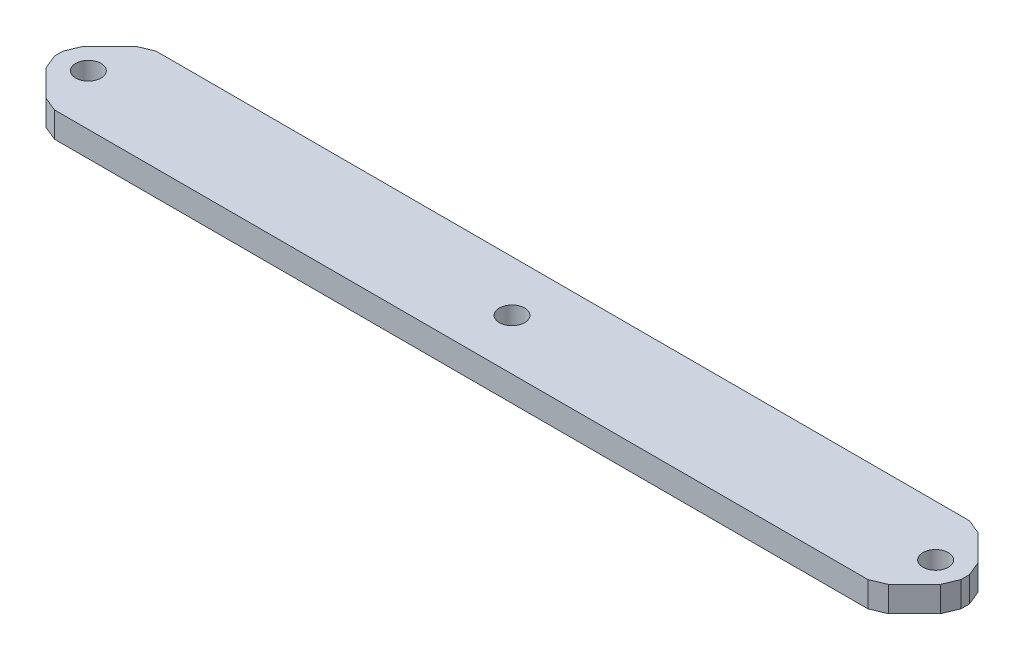
ISO-10303-21;
HEADER;
FILE_DESCRIPTION(('STEP AP214'),'2;1');
FILE_NAME('part.step','',(''),(''),'','','');
FILE_SCHEMA(('AUTOMOTIVE_DESIGN { 1 0 10303 214 1 1 1 1 }'));
ENDSEC;
DATA;
#1=APPLICATION_CONTEXT('core data for automotive mechanical design processes');
#2=APPLICATION_PROTOCOL_DEFINITION('international standard','automotive_design',2000,#1);
#3=PRODUCT_CONTEXT('',#1,'mechanical');
#4=PRODUCT('Part','Part','',(#3));
#5=PRODUCT_RELATED_PRODUCT_CATEGORY('part','',(#4));
#6=PRODUCT_DEFINITION_FORMATION('','',#4);
#7=PRODUCT_DEFINITION_CONTEXT('part definition',#1,'design');
#8=PRODUCT_DEFINITION('design','',#6,#7);
#9=PRODUCT_DEFINITION_SHAPE('','',#8);
#10=(LENGTH_UNIT() NAMED_UNIT(*) SI_UNIT(.MILLI.,.METRE.));
#11=(NAMED_UNIT(*) PLANE_ANGLE_UNIT() SI_UNIT($,.RADIAN.));
#12=(NAMED_UNIT(*) SI_UNIT($,.STERADIAN.) SOLID_ANGLE_UNIT());
#13=UNCERTAINTY_MEASURE_WITH_UNIT(LENGTH_MEASURE(1.E-05),#10,'distance_accuracy_value','');
#14=(GEOMETRIC_REPRESENTATION_CONTEXT(3) GLOBAL_UNCERTAINTY_ASSIGNED_CONTEXT((#13)) GLOBAL_UNIT_ASSIGNED_CONTEXT((#10,
#11,#12)) REPRESENTATION_CONTEXT('',''));
#15=CARTESIAN_POINT('',(0.,0.,0.));
#16=DIRECTION('',(0.,0.,1.));
#17=DIRECTION('',(1.,0.,0.));
#18=AXIS2_PLACEMENT_3D('',#15,#16,#17);
#19=CARTESIAN_POINT('',(0.,3.,0.));
#20=DIRECTION('',(0.,-1.,0.));
#21=DIRECTION('',(0.,0.,-1.));
#22=AXIS2_PLACEMENT_3D('',#19,#20,#21);
#23=PLANE('',#22);
#24=CARTESIAN_POINT('',(-50.,3.,0.));
#25=DIRECTION('',(0.,1.,0.));
#26=DIRECTION('',(0.,0.,1.));
#27=AXIS2_PLACEMENT_3D('',#24,#25,#26);
#28=CIRCLE('',#27,1.5);
#29=CARTESIAN_POINT('',(-50.,3.,1.5));
#30=VERTEX_POINT('',#29);
#31=EDGE_CURVE('E347',#30,#30,#28,.T.);
#32=ORIENTED_EDGE('',*,*,#31,.F.);
#33=EDGE_LOOP('',(#32));
#34=FACE_BOUND('',#33,.T.);
#35=CARTESIAN_POINT('',(0.,3.,0.));
#36=DIRECTION('',(0.,1.,0.));
#37=DIRECTION('',(0.,0.,1.));
#38=AXIS2_PLACEMENT_3D('',#35,#36,#37);
#39=CIRCLE('',#38,1.5);
#40=CARTESIAN_POINT('',(0.,3.,1.5));
#41=VERTEX_POINT('',#40);
#42=EDGE_CURVE('E341',#41,#41,#39,.T.);
#43=ORIENTED_EDGE('',*,*,#42,.F.);
#44=EDGE_LOOP('',(#43));
#45=FACE_BOUND('',#44,.T.);
#46=CARTESIAN_POINT('',(50.,3.,0.));
#47=DIRECTION('',(0.,1.,0.));
#48=DIRECTION('',(0.,0.,1.));
#49=AXIS2_PLACEMENT_3D('',#46,#47,#48);
#50=CIRCLE('',#49,1.5);
#51=CARTESIAN_POINT('',(50.,3.,1.5));
#52=VERTEX_POINT('',#51);
#53=EDGE_CURVE('E332',#52,#52,#50,.T.);
#54=ORIENTED_EDGE('',*,*,#53,.F.);
#55=EDGE_LOOP('',(#54));
#56=FACE_BOUND('',#55,.T.);
#57=DIRECTION('',(1.,0.,0.));
#58=VECTOR('',#57,1.);
#59=CARTESIAN_POINT('',(-52.,3.,6.));
#60=LINE('',#59,#58);
#61=CARTESIAN_POINT('',(-48.,3.,6.));
#62=VERTEX_POINT('',#61);
#63=CARTESIAN_POINT('',(48.,3.,6.));
#64=VERTEX_POINT('',#63);
#65=EDGE_CURVE('E246',#62,#64,#60,.T.);
#66=ORIENTED_EDGE('',*,*,#65,.T.);
#67=DIRECTION('',(-0.923879532511288,0.,0.382683432365087));
#68=VECTOR('',#67,1.);
#69=CARTESIAN_POINT('',(48.,3.,6.));
#70=LINE('',#69,#68);
#71=CARTESIAN_POINT('',(49.7071067811866,3.,5.29289321881345));
#72=VERTEX_POINT('',#71);
#73=EDGE_CURVE('E370',#64,#72,#70,.F.);
#74=ORIENTED_EDGE('',*,*,#73,.T.);
#75=DIRECTION('',(0.707106781186548,0.,-0.707106781186547));
#76=VECTOR('',#75,1.);
#77=CARTESIAN_POINT('',(27.4999999999999,3.,27.5));
#78=LINE('',#77,#76);
#79=CARTESIAN_POINT('',(52.7928932188135,3.,2.20710678118655));
#80=VERTEX_POINT('',#79);
#81=EDGE_CURVE('E382',#72,#80,#78,.T.);
#82=ORIENTED_EDGE('',*,*,#81,.T.);
#83=DIRECTION('',(-0.382683432365088,0.,0.923879532511288));
#84=VECTOR('',#83,1.);
#85=CARTESIAN_POINT('',(52.7928932188135,3.,2.20710678118654));
#86=LINE('',#85,#84);
#87=CARTESIAN_POINT('',(53.5,3.,0.500000000000011));
#88=VERTEX_POINT('',#87);
#89=EDGE_CURVE('E368',#80,#88,#86,.F.);
#90=ORIENTED_EDGE('',*,*,#89,.T.);
#91=DIRECTION('',(0.,0.,-1.));
#92=VECTOR('',#91,1.);
#93=CARTESIAN_POINT('',(53.5,3.,0.));
#94=LINE('',#93,#92);
#95=CARTESIAN_POINT('',(53.5,3.,-0.499999999999979));
#96=VERTEX_POINT('',#95);
#97=EDGE_CURVE('E329',#88,#96,#94,.T.);
#98=ORIENTED_EDGE('',*,*,#97,.T.);
#99=DIRECTION('',(-0.382683432365088,0.,-0.923879532511288));
#100=VECTOR('',#99,1.);
#101=CARTESIAN_POINT('',(53.5,3.,-0.499999999999979));
#102=LINE('',#101,#100);
#103=CARTESIAN_POINT('',(52.7928932188134,3.,-2.20710678118657));
#104=VERTEX_POINT('',#103);
#105=EDGE_CURVE('E366',#96,#104,#102,.T.);
#106=ORIENTED_EDGE('',*,*,#105,.T.);
#107=DIRECTION('',(0.707106781186548,0.,0.707106781186547));
#108=VECTOR('',#107,1.);
#109=CARTESIAN_POINT('',(27.4999999999999,3.,-27.5));
#110=LINE('',#109,#108);
#111=CARTESIAN_POINT('',(49.7071067811865,3.,-5.29289321881346));
#112=VERTEX_POINT('',#111);
#113=EDGE_CURVE('E390',#112,#104,#110,.T.);
#114=ORIENTED_EDGE('',*,*,#113,.F.);
#115=DIRECTION('',(0.923879532511289,0.,0.382683432365084));
#116=VECTOR('',#115,1.);
#117=CARTESIAN_POINT('',(49.7071067811865,3.,-5.29289321881346));
#118=LINE('',#117,#116);
#119=CARTESIAN_POINT('',(48.,3.,-6.));
#120=VERTEX_POINT('',#119);
#121=EDGE_CURVE('E364',#112,#120,#118,.F.);
#122=ORIENTED_EDGE('',*,*,#121,.T.);
#123=DIRECTION('',(1.,0.,0.));
#124=VECTOR('',#123,1.);
#125=CARTESIAN_POINT('',(-52.,3.,-6.));
#126=LINE('',#125,#124);
#127=CARTESIAN_POINT('',(-48.,3.,-6.));
#128=VERTEX_POINT('',#127);
#129=EDGE_CURVE('E259',#128,#120,#126,.T.);
#130=ORIENTED_EDGE('',*,*,#129,.F.);
#131=DIRECTION('',(-0.923879532511288,0.,0.382683432365086));
#132=VECTOR('',#131,1.);
#133=CARTESIAN_POINT('',(-48.,3.,-6.));
#134=LINE('',#133,#132);
#135=CARTESIAN_POINT('',(-49.7071067811866,3.,-5.29289321881345));
#136=VERTEX_POINT('',#135);
#137=EDGE_CURVE('E362',#128,#136,#134,.T.);
#138=ORIENTED_EDGE('',*,*,#137,.T.);
#139=DIRECTION('',(-0.707106781186549,0.,0.707106781186547));
#140=VECTOR('',#139,1.);
#141=CARTESIAN_POINT('',(-27.4999999999999,3.,-27.5));
#142=LINE('',#141,#140);
#143=CARTESIAN_POINT('',(-52.7928932188135,3.,-2.20710678118657));
#144=VERTEX_POINT('',#143);
#145=EDGE_CURVE('E388',#136,#144,#142,.T.);
#146=ORIENTED_EDGE('',*,*,#145,.T.);
#147=DIRECTION('',(0.38268343236509,0.,-0.923879532511287));
#148=VECTOR('',#147,1.);
#149=CARTESIAN_POINT('',(-52.7928932188135,3.,-2.20710678118657));
#150=LINE('',#149,#148);
#151=CARTESIAN_POINT('',(-53.5,3.,-0.500000000000015));
#152=VERTEX_POINT('',#151);
#153=EDGE_CURVE('E327',#144,#152,#150,.F.);
#154=ORIENTED_EDGE('',*,*,#153,.T.);
#155=DIRECTION('',(0.,0.,1.));
#156=VECTOR('',#155,1.);
#157=CARTESIAN_POINT('',(-53.5,3.,0.));
#158=LINE('',#157,#156);
#159=CARTESIAN_POINT('',(-53.5,3.,0.499999999999961));
#160=VERTEX_POINT('',#159);
#161=EDGE_CURVE('E322',#152,#160,#158,.T.);
#162=ORIENTED_EDGE('',*,*,#161,.T.);
#163=DIRECTION('',(0.382683432365089,0.,0.923879532511287));
#164=VECTOR('',#163,1.);
#165=CARTESIAN_POINT('',(-53.5,3.,0.499999999999961));
#166=LINE('',#165,#164);
#167=CARTESIAN_POINT('',(-52.7928932188134,3.,2.2071067811866));
#168=VERTEX_POINT('',#167);
#169=EDGE_CURVE('E317',#160,#168,#166,.T.);
#170=ORIENTED_EDGE('',*,*,#169,.T.);
#171=DIRECTION('',(-0.707106781186549,0.,-0.707106781186547));
#172=VECTOR('',#171,1.);
#173=CARTESIAN_POINT('',(-27.4999999999999,3.,27.5));
#174=LINE('',#173,#172);
#175=CARTESIAN_POINT('',(-49.7071067811866,3.,5.29289321881344));
#176=VERTEX_POINT('',#175);
#177=EDGE_CURVE('E309',#176,#168,#174,.T.);
#178=ORIENTED_EDGE('',*,*,#177,.F.);
#179=DIRECTION('',(0.923879532511287,0.,0.38268343236509));
#180=VECTOR('',#179,1.);
#181=CARTESIAN_POINT('',(-49.7071067811866,3.,5.29289321881344));
#182=LINE('',#181,#180);
#183=EDGE_CURVE('E359',#176,#62,#182,.T.);
#184=ORIENTED_EDGE('',*,*,#183,.T.);
#185=EDGE_LOOP('',(#66,#74,#82,#90,#98,#106,#114,#122,#130,#138,#146,#154,#162,#170,#178,#184));
#186=FACE_BOUND('',#185,.T.);
#187=ADVANCED_FACE('F122',(#34,#45,#56,#186),#23,.F.);
#188=CARTESIAN_POINT('',(0.,0.,0.));
#189=DIRECTION('',(0.,-1.,0.));
#190=DIRECTION('',(0.,0.,-1.));
#191=AXIS2_PLACEMENT_3D('',#188,#189,#190);
#192=PLANE('',#191);
#193=DIRECTION('',(-0.707106781186549,0.,0.707106781186547));
#194=VECTOR('',#193,1.);
#195=CARTESIAN_POINT('',(53.5,0.,1.50000000000001));
#196=LINE('',#195,#194);
#197=CARTESIAN_POINT('',(52.7928932188135,0.,2.20710678118654));
#198=VERTEX_POINT('',#197);
#199=CARTESIAN_POINT('',(49.7071067811866,0.,5.29289321881345));
#200=VERTEX_POINT('',#199);
#201=EDGE_CURVE('E379',#198,#200,#196,.T.);
#202=ORIENTED_EDGE('',*,*,#201,.T.);
#203=DIRECTION('',(0.923879532511288,0.,-0.382683432365087));
#204=VECTOR('',#203,1.);
#205=CARTESIAN_POINT('',(9.15075759508237,0.,22.0918830920367));
#206=LINE('',#205,#204);
#207=CARTESIAN_POINT('',(48.,0.,6.));
#208=VERTEX_POINT('',#207);
#209=EDGE_CURVE('E258',#200,#208,#206,.F.);
#210=ORIENTED_EDGE('',*,*,#209,.T.);
#211=DIRECTION('',(1.,0.,0.));
#212=VECTOR('',#211,1.);
#213=CARTESIAN_POINT('',(-52.,0.,6.));
#214=LINE('',#213,#212);
#215=CARTESIAN_POINT('',(-48.,0.,6.));
#216=VERTEX_POINT('',#215);
#217=EDGE_CURVE('E243',#216,#208,#214,.T.);
#218=ORIENTED_EDGE('',*,*,#217,.F.);
#219=DIRECTION('',(-0.923879532511287,0.,-0.38268343236509));
#220=VECTOR('',#219,1.);
#221=CARTESIAN_POINT('',(-9.15075759508252,0.,22.0918830920368));
#222=LINE('',#221,#220);
#223=CARTESIAN_POINT('',(-49.7071067811866,0.,5.29289321881344));
#224=VERTEX_POINT('',#223);
#225=EDGE_CURVE('E255',#216,#224,#222,.T.);
#226=ORIENTED_EDGE('',*,*,#225,.T.);
#227=DIRECTION('',(0.707106781186549,0.,0.707106781186547));
#228=VECTOR('',#227,1.);
#229=CARTESIAN_POINT('',(-27.4999999999999,0.,27.5));
#230=LINE('',#229,#228);
#231=CARTESIAN_POINT('',(-52.7928932188134,0.,2.2071067811866));
#232=VERTEX_POINT('',#231);
#233=EDGE_CURVE('E307',#232,#224,#230,.T.);
#234=ORIENTED_EDGE('',*,*,#233,.F.);
#235=DIRECTION('',(-0.382683432365089,0.,-0.923879532511287));
#236=VECTOR('',#235,1.);
#237=CARTESIAN_POINT('',(-45.8418830920368,0.,18.9883297014435));
#238=LINE('',#237,#236);
#239=CARTESIAN_POINT('',(-53.5,0.,0.499999999999961));
#240=VERTEX_POINT('',#239);
#241=EDGE_CURVE('E265',#232,#240,#238,.T.);
#242=ORIENTED_EDGE('',*,*,#241,.T.);
#243=DIRECTION('',(0.,0.,-1.));
#244=VECTOR('',#243,1.);
#245=CARTESIAN_POINT('',(-53.5,0.,-4.5));
#246=LINE('',#245,#244);
#247=CARTESIAN_POINT('',(-53.5,0.,-0.500000000000015));
#248=VERTEX_POINT('',#247);
#249=EDGE_CURVE('E324',#240,#248,#246,.T.);
#250=ORIENTED_EDGE('',*,*,#249,.T.);
#251=DIRECTION('',(-0.38268343236509,0.,0.923879532511287));
#252=VECTOR('',#251,1.);
#253=CARTESIAN_POINT('',(-45.8418830920368,0.,-18.9883297014435));
#254=LINE('',#253,#252);
#255=CARTESIAN_POINT('',(-52.7928932188135,0.,-2.20710678118657));
#256=VERTEX_POINT('',#255);
#257=EDGE_CURVE('E264',#248,#256,#254,.F.);
#258=ORIENTED_EDGE('',*,*,#257,.T.);
#259=DIRECTION('',(0.707106781186549,0.,-0.707106781186547));
#260=VECTOR('',#259,1.);
#261=CARTESIAN_POINT('',(-27.4999999999999,0.,-27.5));
#262=LINE('',#261,#260);
#263=CARTESIAN_POINT('',(-49.7071067811866,0.,-5.29289321881345));
#264=VERTEX_POINT('',#263);
#265=EDGE_CURVE('E314',#256,#264,#262,.T.);
#266=ORIENTED_EDGE('',*,*,#265,.T.);
#267=DIRECTION('',(0.923879532511288,0.,-0.382683432365086));
#268=VECTOR('',#267,1.);
#269=CARTESIAN_POINT('',(-9.15075759508236,0.,-22.0918830920367));
#270=LINE('',#269,#268);
#271=CARTESIAN_POINT('',(-48.,0.,-6.));
#272=VERTEX_POINT('',#271);
#273=EDGE_CURVE('E267',#264,#272,#270,.T.);
#274=ORIENTED_EDGE('',*,*,#273,.T.);
#275=DIRECTION('',(1.,0.,0.));
#276=VECTOR('',#275,1.);
#277=CARTESIAN_POINT('',(-52.,0.,-6.));
#278=LINE('',#277,#276);
#279=CARTESIAN_POINT('',(48.,0.,-6.));
#280=VERTEX_POINT('',#279);
#281=EDGE_CURVE('E260',#272,#280,#278,.T.);
#282=ORIENTED_EDGE('',*,*,#281,.T.);
#283=DIRECTION('',(-0.923879532511289,0.,-0.382683432365084));
#284=VECTOR('',#283,1.);
#285=CARTESIAN_POINT('',(9.15075759508228,0.,-22.0918830920366));
#286=LINE('',#285,#284);
#287=CARTESIAN_POINT('',(49.7071067811865,0.,-5.29289321881346));
#288=VERTEX_POINT('',#287);
#289=EDGE_CURVE('E274',#280,#288,#286,.F.);
#290=ORIENTED_EDGE('',*,*,#289,.T.);
#291=DIRECTION('',(-0.707106781186549,0.,-0.707106781186547));
#292=VECTOR('',#291,1.);
#293=CARTESIAN_POINT('',(53.5,0.,-1.50000000000001));
#294=LINE('',#293,#292);
#295=CARTESIAN_POINT('',(52.7928932188134,0.,-2.20710678118656));
#296=VERTEX_POINT('',#295);
#297=EDGE_CURVE('E385',#296,#288,#294,.T.);
#298=ORIENTED_EDGE('',*,*,#297,.F.);
#299=DIRECTION('',(0.382683432365088,0.,0.923879532511288));
#300=VECTOR('',#299,1.);
#301=CARTESIAN_POINT('',(45.8418830920369,0.,-18.9883297014434));
#302=LINE('',#301,#300);
#303=CARTESIAN_POINT('',(53.5,0.,-0.499999999999979));
#304=VERTEX_POINT('',#303);
#305=EDGE_CURVE('E145',#296,#304,#302,.T.);
#306=ORIENTED_EDGE('',*,*,#305,.T.);
#307=DIRECTION('',(0.,0.,1.));
#308=VECTOR('',#307,1.);
#309=CARTESIAN_POINT('',(53.5,0.,-4.5));
#310=LINE('',#309,#308);
#311=CARTESIAN_POINT('',(53.5,0.,0.500000000000011));
#312=VERTEX_POINT('',#311);
#313=EDGE_CURVE('E396',#304,#312,#310,.T.);
#314=ORIENTED_EDGE('',*,*,#313,.T.);
#315=DIRECTION('',(0.382683432365088,0.,-0.923879532511288));
#316=VECTOR('',#315,1.);
#317=CARTESIAN_POINT('',(45.8418830920369,0.,18.9883297014435));
#318=LINE('',#317,#316);
#319=EDGE_CURVE('E277',#312,#198,#318,.F.);
#320=ORIENTED_EDGE('',*,*,#319,.T.);
#321=EDGE_LOOP('',(#202,#210,#218,#226,#234,#242,#250,#258,#266,#274,#282,#290,#298,#306,#314,#320));
#322=FACE_BOUND('',#321,.T.);
#323=CARTESIAN_POINT('',(0.,0.,0.));
#324=DIRECTION('',(0.,1.,0.));
#325=DIRECTION('',(0.,0.,1.));
#326=AXIS2_PLACEMENT_3D('',#323,#324,#325);
#327=CIRCLE('',#326,1.5);
#328=CARTESIAN_POINT('',(0.,0.,1.5));
#329=VERTEX_POINT('',#328);
#330=EDGE_CURVE('E339',#329,#329,#327,.T.);
#331=ORIENTED_EDGE('',*,*,#330,.T.);
#332=EDGE_LOOP('',(#331));
#333=FACE_BOUND('',#332,.T.);
#334=CARTESIAN_POINT('',(-50.,0.,0.));
#335=DIRECTION('',(0.,1.,0.));
#336=DIRECTION('',(0.,0.,1.));
#337=AXIS2_PLACEMENT_3D('',#334,#335,#336);
#338=CIRCLE('',#337,1.5);
#339=CARTESIAN_POINT('',(-50.,0.,1.5));
#340=VERTEX_POINT('',#339);
#341=EDGE_CURVE('E344',#340,#340,#338,.T.);
#342=ORIENTED_EDGE('',*,*,#341,.T.);
#343=EDGE_LOOP('',(#342));
#344=FACE_BOUND('',#343,.T.);
#345=CARTESIAN_POINT('',(50.,0.,0.));
#346=DIRECTION('',(0.,1.,0.));
#347=DIRECTION('',(0.,0.,1.));
#348=AXIS2_PLACEMENT_3D('',#345,#346,#347);
#349=CIRCLE('',#348,1.5);
#350=CARTESIAN_POINT('',(50.,0.,1.5));
#351=VERTEX_POINT('',#350);
#352=EDGE_CURVE('E328',#351,#351,#349,.T.);
#353=ORIENTED_EDGE('',*,*,#352,.T.);
#354=EDGE_LOOP('',(#353));
#355=FACE_BOUND('',#354,.T.);
#356=ADVANCED_FACE('F252',(#322,#333,#344,#355),#192,.T.);
#357=CARTESIAN_POINT('',(-52.,3.,-6.));
#358=DIRECTION('',(0.,0.,-1.));
#359=DIRECTION('',(-1.,0.,0.));
#360=AXIS2_PLACEMENT_3D('',#357,#358,#359);
#361=PLANE('',#360);
#362=ORIENTED_EDGE('',*,*,#129,.T.);
#363=DIRECTION('',(0.,-1.,0.));
#364=VECTOR('',#363,1.);
#365=CARTESIAN_POINT('',(48.,3.,-6.));
#366=LINE('',#365,#364);
#367=EDGE_CURVE('E292',#120,#280,#366,.T.);
#368=ORIENTED_EDGE('',*,*,#367,.T.);
#369=ORIENTED_EDGE('',*,*,#281,.F.);
#370=DIRECTION('',(0.,1.,0.));
#371=VECTOR('',#370,1.);
#372=CARTESIAN_POINT('',(-48.,3.,-6.));
#373=LINE('',#372,#371);
#374=EDGE_CURVE('E289',#272,#128,#373,.T.);
#375=ORIENTED_EDGE('',*,*,#374,.T.);
#376=EDGE_LOOP('',(#362,#368,#369,#375));
#377=FACE_BOUND('',#376,.T.);
#378=ADVANCED_FACE('F415',(#377),#361,.T.);
#379=CARTESIAN_POINT('',(-52.,3.,6.));
#380=DIRECTION('',(0.,0.,-1.));
#381=DIRECTION('',(-1.,0.,0.));
#382=AXIS2_PLACEMENT_3D('',#379,#380,#381);
#383=PLANE('',#382);
#384=ORIENTED_EDGE('',*,*,#217,.T.);
#385=DIRECTION('',(0.,1.,0.));
#386=VECTOR('',#385,1.);
#387=CARTESIAN_POINT('',(48.,3.,6.));
#388=LINE('',#387,#386);
#389=EDGE_CURVE('E249',#208,#64,#388,.T.);
#390=ORIENTED_EDGE('',*,*,#389,.T.);
#391=ORIENTED_EDGE('',*,*,#65,.F.);
#392=DIRECTION('',(0.,-1.,0.));
#393=VECTOR('',#392,1.);
#394=CARTESIAN_POINT('',(-48.,0.,6.));
#395=LINE('',#394,#393);
#396=EDGE_CURVE('E239',#62,#216,#395,.T.);
#397=ORIENTED_EDGE('',*,*,#396,.T.);
#398=EDGE_LOOP('',(#384,#390,#391,#397));
#399=FACE_BOUND('',#398,.T.);
#400=ADVANCED_FACE('F241',(#399),#383,.F.);
#401=CARTESIAN_POINT('',(53.5,0.,-4.5));
#402=DIRECTION('',(-1.,0.,0.));
#403=DIRECTION('',(0.,0.,1.));
#404=AXIS2_PLACEMENT_3D('',#401,#402,#403);
#405=PLANE('',#404);
#406=ORIENTED_EDGE('',*,*,#97,.F.);
#407=DIRECTION('',(0.,-1.,0.));
#408=VECTOR('',#407,1.);
#409=CARTESIAN_POINT('',(53.5,0.,0.500000000000011));
#410=LINE('',#409,#408);
#411=EDGE_CURVE('E138',#88,#312,#410,.T.);
#412=ORIENTED_EDGE('',*,*,#411,.T.);
#413=ORIENTED_EDGE('',*,*,#313,.F.);
#414=DIRECTION('',(0.,1.,0.));
#415=VECTOR('',#414,1.);
#416=CARTESIAN_POINT('',(53.5,3.,-0.499999999999979));
#417=LINE('',#416,#415);
#418=EDGE_CURVE('E280',#304,#96,#417,.T.);
#419=ORIENTED_EDGE('',*,*,#418,.T.);
#420=EDGE_LOOP('',(#406,#412,#413,#419));
#421=FACE_BOUND('',#420,.T.);
#422=ADVANCED_FACE('F400',(#421),#405,.F.);
#423=CARTESIAN_POINT('',(-53.5,0.,-4.5));
#424=DIRECTION('',(1.,0.,0.));
#425=DIRECTION('',(0.,0.,-1.));
#426=AXIS2_PLACEMENT_3D('',#423,#424,#425);
#427=PLANE('',#426);
#428=ORIENTED_EDGE('',*,*,#161,.F.);
#429=DIRECTION('',(0.,-1.,0.));
#430=VECTOR('',#429,1.);
#431=CARTESIAN_POINT('',(-53.5,0.,-0.500000000000015));
#432=LINE('',#431,#430);
#433=EDGE_CURVE('E302',#152,#248,#432,.T.);
#434=ORIENTED_EDGE('',*,*,#433,.T.);
#435=ORIENTED_EDGE('',*,*,#249,.F.);
#436=DIRECTION('',(0.,1.,0.));
#437=VECTOR('',#436,1.);
#438=CARTESIAN_POINT('',(-53.5,3.,0.499999999999961));
#439=LINE('',#438,#437);
#440=EDGE_CURVE('E299',#240,#160,#439,.T.);
#441=ORIENTED_EDGE('',*,*,#440,.T.);
#442=EDGE_LOOP('',(#428,#434,#435,#441));
#443=FACE_BOUND('',#442,.T.);
#444=ADVANCED_FACE('F321',(#443),#427,.F.);
#445=CARTESIAN_POINT('',(-50.,3.,0.));
#446=DIRECTION('',(0.,-1.,0.));
#447=DIRECTION('',(0.,0.,-1.));
#448=AXIS2_PLACEMENT_3D('',#445,#446,#447);
#449=CYLINDRICAL_SURFACE('',#448,1.5);
#450=ORIENTED_EDGE('',*,*,#31,.T.);
#451=EDGE_LOOP('',(#450));
#452=FACE_BOUND('',#451,.T.);
#453=ORIENTED_EDGE('',*,*,#341,.F.);
#454=EDGE_LOOP('',(#453));
#455=FACE_BOUND('',#454,.T.);
#456=ADVANCED_FACE('F452',(#452,#455),#449,.F.);
#457=CARTESIAN_POINT('',(0.,3.,0.));
#458=DIRECTION('',(0.,-1.,0.));
#459=DIRECTION('',(0.,0.,-1.));
#460=AXIS2_PLACEMENT_3D('',#457,#458,#459);
#461=CYLINDRICAL_SURFACE('',#460,1.5);
#462=ORIENTED_EDGE('',*,*,#42,.T.);
#463=EDGE_LOOP('',(#462));
#464=FACE_BOUND('',#463,.T.);
#465=ORIENTED_EDGE('',*,*,#330,.F.);
#466=EDGE_LOOP('',(#465));
#467=FACE_BOUND('',#466,.T.);
#468=ADVANCED_FACE('F603',(#464,#467),#461,.F.);
#469=CARTESIAN_POINT('',(50.,3.,0.));
#470=DIRECTION('',(0.,-1.,0.));
#471=DIRECTION('',(0.,0.,-1.));
#472=AXIS2_PLACEMENT_3D('',#469,#470,#471);
#473=CYLINDRICAL_SURFACE('',#472,1.5);
#474=ORIENTED_EDGE('',*,*,#53,.T.);
#475=EDGE_LOOP('',(#474));
#476=FACE_BOUND('',#475,.T.);
#477=ORIENTED_EDGE('',*,*,#352,.F.);
#478=EDGE_LOOP('',(#477));
#479=FACE_BOUND('',#478,.T.);
#480=ADVANCED_FACE('F559',(#476,#479),#473,.F.);
#481=CARTESIAN_POINT('',(-27.4999999999999,0.,27.5));
#482=DIRECTION('',(-0.707106781186546,0.,0.707106781186548));
#483=DIRECTION('',(0.707106781186549,0.,0.707106781186547));
#484=AXIS2_PLACEMENT_3D('',#481,#482,#483);
#485=PLANE('',#484);
#486=ORIENTED_EDGE('',*,*,#233,.T.);
#487=DIRECTION('',(0.,1.,0.));
#488=VECTOR('',#487,1.);
#489=CARTESIAN_POINT('',(-49.7071067811866,3.,5.29289321881344));
#490=LINE('',#489,#488);
#491=EDGE_CURVE('E12',#224,#176,#490,.T.);
#492=ORIENTED_EDGE('',*,*,#491,.T.);
#493=ORIENTED_EDGE('',*,*,#177,.T.);
#494=DIRECTION('',(0.,-1.,0.));
#495=VECTOR('',#494,1.);
#496=CARTESIAN_POINT('',(-52.7928932188134,0.,2.20710678118661));
#497=LINE('',#496,#495);
#498=EDGE_CURVE('E131',#168,#232,#497,.T.);
#499=ORIENTED_EDGE('',*,*,#498,.T.);
#500=EDGE_LOOP('',(#486,#492,#493,#499));
#501=FACE_BOUND('',#500,.T.);
#502=ADVANCED_FACE('F306',(#501),#485,.T.);
#503=CARTESIAN_POINT('',(-27.4999999999999,0.,-27.5));
#504=DIRECTION('',(0.707106781186546,0.,0.707106781186548));
#505=DIRECTION('',(0.707106781186549,0.,-0.707106781186547));
#506=AXIS2_PLACEMENT_3D('',#503,#504,#505);
#507=PLANE('',#506);
#508=ORIENTED_EDGE('',*,*,#145,.F.);
#509=DIRECTION('',(0.,-1.,0.));
#510=VECTOR('',#509,1.);
#511=CARTESIAN_POINT('',(-49.7071067811866,0.,-5.29289321881345));
#512=LINE('',#511,#510);
#513=EDGE_CURVE('E297',#136,#264,#512,.T.);
#514=ORIENTED_EDGE('',*,*,#513,.T.);
#515=ORIENTED_EDGE('',*,*,#265,.F.);
#516=DIRECTION('',(0.,1.,0.));
#517=VECTOR('',#516,1.);
#518=CARTESIAN_POINT('',(-52.7928932188135,0.,-2.20710678118657));
#519=LINE('',#518,#517);
#520=EDGE_CURVE('E294',#256,#144,#519,.T.);
#521=ORIENTED_EDGE('',*,*,#520,.T.);
#522=EDGE_LOOP('',(#508,#514,#515,#521));
#523=FACE_BOUND('',#522,.T.);
#524=ADVANCED_FACE('F424',(#523),#507,.F.);
#525=CARTESIAN_POINT('',(53.5,0.,-1.50000000000001));
#526=DIRECTION('',(0.707106781186547,0.,-0.707106781186548));
#527=DIRECTION('',(-0.707106781186548,0.,-0.707106781186547));
#528=AXIS2_PLACEMENT_3D('',#525,#526,#527);
#529=PLANE('',#528);
#530=ORIENTED_EDGE('',*,*,#113,.T.);
#531=DIRECTION('',(0.,-1.,0.));
#532=VECTOR('',#531,1.);
#533=CARTESIAN_POINT('',(52.7928932188134,0.,-2.20710678118656));
#534=LINE('',#533,#532);
#535=EDGE_CURVE('E287',#104,#296,#534,.T.);
#536=ORIENTED_EDGE('',*,*,#535,.T.);
#537=ORIENTED_EDGE('',*,*,#297,.T.);
#538=DIRECTION('',(0.,1.,0.));
#539=VECTOR('',#538,1.);
#540=CARTESIAN_POINT('',(49.7071067811865,0.,-5.29289321881346));
#541=LINE('',#540,#539);
#542=EDGE_CURVE('E284',#288,#112,#541,.T.);
#543=ORIENTED_EDGE('',*,*,#542,.T.);
#544=EDGE_LOOP('',(#530,#536,#537,#543));
#545=FACE_BOUND('',#544,.T.);
#546=ADVANCED_FACE('F406',(#545),#529,.T.);
#547=CARTESIAN_POINT('',(53.5,0.,1.50000000000001));
#548=DIRECTION('',(-0.707106781186547,0.,-0.707106781186548));
#549=DIRECTION('',(-0.707106781186548,0.,0.707106781186547));
#550=AXIS2_PLACEMENT_3D('',#547,#548,#549);
#551=PLANE('',#550);
#552=ORIENTED_EDGE('',*,*,#81,.F.);
#553=DIRECTION('',(0.,-1.,0.));
#554=VECTOR('',#553,1.);
#555=CARTESIAN_POINT('',(49.7071067811866,0.,5.29289321881345));
#556=LINE('',#555,#554);
#557=EDGE_CURVE('E269',#72,#200,#556,.T.);
#558=ORIENTED_EDGE('',*,*,#557,.T.);
#559=ORIENTED_EDGE('',*,*,#201,.F.);
#560=DIRECTION('',(0.,1.,0.));
#561=VECTOR('',#560,1.);
#562=CARTESIAN_POINT('',(52.7928932188135,0.,2.20710678118654));
#563=LINE('',#562,#561);
#564=EDGE_CURVE('E372',#198,#80,#563,.T.);
#565=ORIENTED_EDGE('',*,*,#564,.T.);
#566=EDGE_LOOP('',(#552,#558,#559,#565));
#567=FACE_BOUND('',#566,.T.);
#568=ADVANCED_FACE('F378',(#567),#551,.F.);
#569=CARTESIAN_POINT('',(48.,3.,6.));
#570=DIRECTION('',(-0.382683432365087,0.,-0.923879532511288));
#571=DIRECTION('',(0.,1.,0.));
#572=AXIS2_PLACEMENT_3D('',#569,#570,#571);
#573=PLANE('',#572);
#574=ORIENTED_EDGE('',*,*,#209,.F.);
#575=ORIENTED_EDGE('',*,*,#557,.F.);
#576=ORIENTED_EDGE('',*,*,#73,.F.);
#577=ORIENTED_EDGE('',*,*,#389,.F.);
#578=EDGE_LOOP('',(#574,#575,#576,#577));
#579=FACE_BOUND('',#578,.T.);
#580=ADVANCED_FACE('F387',(#579),#573,.F.);
#581=CARTESIAN_POINT('',(52.7928932188135,0.,2.20710678118654));
#582=DIRECTION('',(-0.923879532511287,0.,-0.382683432365088));
#583=DIRECTION('',(0.,1.,0.));
#584=AXIS2_PLACEMENT_3D('',#581,#582,#583);
#585=PLANE('',#584);
#586=ORIENTED_EDGE('',*,*,#319,.F.);
#587=ORIENTED_EDGE('',*,*,#411,.F.);
#588=ORIENTED_EDGE('',*,*,#89,.F.);
#589=ORIENTED_EDGE('',*,*,#564,.F.);
#590=EDGE_LOOP('',(#586,#587,#588,#589));
#591=FACE_BOUND('',#590,.T.);
#592=ADVANCED_FACE('F399',(#591),#585,.F.);
#593=CARTESIAN_POINT('',(53.5,0.,-0.499999999999979));
#594=DIRECTION('',(0.923879532511288,0.,-0.382683432365088));
#595=DIRECTION('',(0.,-1.,0.));
#596=AXIS2_PLACEMENT_3D('',#593,#594,#595);
#597=PLANE('',#596);
#598=ORIENTED_EDGE('',*,*,#305,.F.);
#599=ORIENTED_EDGE('',*,*,#535,.F.);
#600=ORIENTED_EDGE('',*,*,#105,.F.);
#601=ORIENTED_EDGE('',*,*,#418,.F.);
#602=EDGE_LOOP('',(#598,#599,#600,#601));
#603=FACE_BOUND('',#602,.T.);
#604=ADVANCED_FACE('F402',(#603),#597,.T.);
#605=CARTESIAN_POINT('',(49.7071067811865,0.,-5.29289321881346));
#606=DIRECTION('',(-0.382683432365084,0.,0.923879532511289));
#607=DIRECTION('',(0.,1.,0.));
#608=AXIS2_PLACEMENT_3D('',#605,#606,#607);
#609=PLANE('',#608);
#610=ORIENTED_EDGE('',*,*,#289,.F.);
#611=ORIENTED_EDGE('',*,*,#367,.F.);
#612=ORIENTED_EDGE('',*,*,#121,.F.);
#613=ORIENTED_EDGE('',*,*,#542,.F.);
#614=EDGE_LOOP('',(#610,#611,#612,#613));
#615=FACE_BOUND('',#614,.T.);
#616=ADVANCED_FACE('F411',(#615),#609,.F.);
#617=CARTESIAN_POINT('',(-48.,3.,-6.));
#618=DIRECTION('',(-0.382683432365086,0.,-0.923879532511288));
#619=DIRECTION('',(0.,-1.,0.));
#620=AXIS2_PLACEMENT_3D('',#617,#618,#619);
#621=PLANE('',#620);
#622=ORIENTED_EDGE('',*,*,#273,.F.);
#623=ORIENTED_EDGE('',*,*,#513,.F.);
#624=ORIENTED_EDGE('',*,*,#137,.F.);
#625=ORIENTED_EDGE('',*,*,#374,.F.);
#626=EDGE_LOOP('',(#622,#623,#624,#625));
#627=FACE_BOUND('',#626,.T.);
#628=ADVANCED_FACE('F420',(#627),#621,.T.);
#629=CARTESIAN_POINT('',(-52.7928932188135,0.,-2.20710678118657));
#630=DIRECTION('',(0.923879532511287,0.,0.38268343236509));
#631=DIRECTION('',(0.,1.,0.));
#632=AXIS2_PLACEMENT_3D('',#629,#630,#631);
#633=PLANE('',#632);
#634=ORIENTED_EDGE('',*,*,#257,.F.);
#635=ORIENTED_EDGE('',*,*,#433,.F.);
#636=ORIENTED_EDGE('',*,*,#153,.F.);
#637=ORIENTED_EDGE('',*,*,#520,.F.);
#638=EDGE_LOOP('',(#634,#635,#636,#637));
#639=FACE_BOUND('',#638,.T.);
#640=ADVANCED_FACE('F430',(#639),#633,.F.);
#641=CARTESIAN_POINT('',(-49.7071067811866,0.,5.29289321881344));
#642=DIRECTION('',(-0.38268343236509,0.,0.923879532511287));
#643=DIRECTION('',(0.,-1.,0.));
#644=AXIS2_PLACEMENT_3D('',#641,#642,#643);
#645=PLANE('',#644);
#646=ORIENTED_EDGE('',*,*,#225,.F.);
#647=ORIENTED_EDGE('',*,*,#396,.F.);
#648=ORIENTED_EDGE('',*,*,#183,.F.);
#649=ORIENTED_EDGE('',*,*,#491,.F.);
#650=EDGE_LOOP('',(#646,#647,#648,#649));
#651=FACE_BOUND('',#650,.T.);
#652=ADVANCED_FACE('F263',(#651),#645,.T.);
#653=CARTESIAN_POINT('',(-53.5,0.,0.499999999999961));
#654=DIRECTION('',(-0.923879532511287,0.,0.382683432365089));
#655=DIRECTION('',(0.,-1.,0.));
#656=AXIS2_PLACEMENT_3D('',#653,#654,#655);
#657=PLANE('',#656);
#658=ORIENTED_EDGE('',*,*,#241,.F.);
#659=ORIENTED_EDGE('',*,*,#498,.F.);
#660=ORIENTED_EDGE('',*,*,#169,.F.);
#661=ORIENTED_EDGE('',*,*,#440,.F.);
#662=EDGE_LOOP('',(#658,#659,#660,#661));
#663=FACE_BOUND('',#662,.T.);
#664=ADVANCED_FACE('F125',(#663),#657,.T.);
#665=CLOSED_SHELL('',(#187,#356,#378,#400,#422,#444,#456,#468,#480,#502,#524,#546,#568,#580,
#592,#604,#616,#628,#640,#652,#664));
#666=MANIFOLD_SOLID_BREP('B2',#665);
#667=ADVANCED_BREP_SHAPE_REPRESENTATION('',(#18,#666),#14);
#668=SHAPE_DEFINITION_REPRESENTATION(#9,#667);
ENDSEC;
END-ISO-10303-21;
